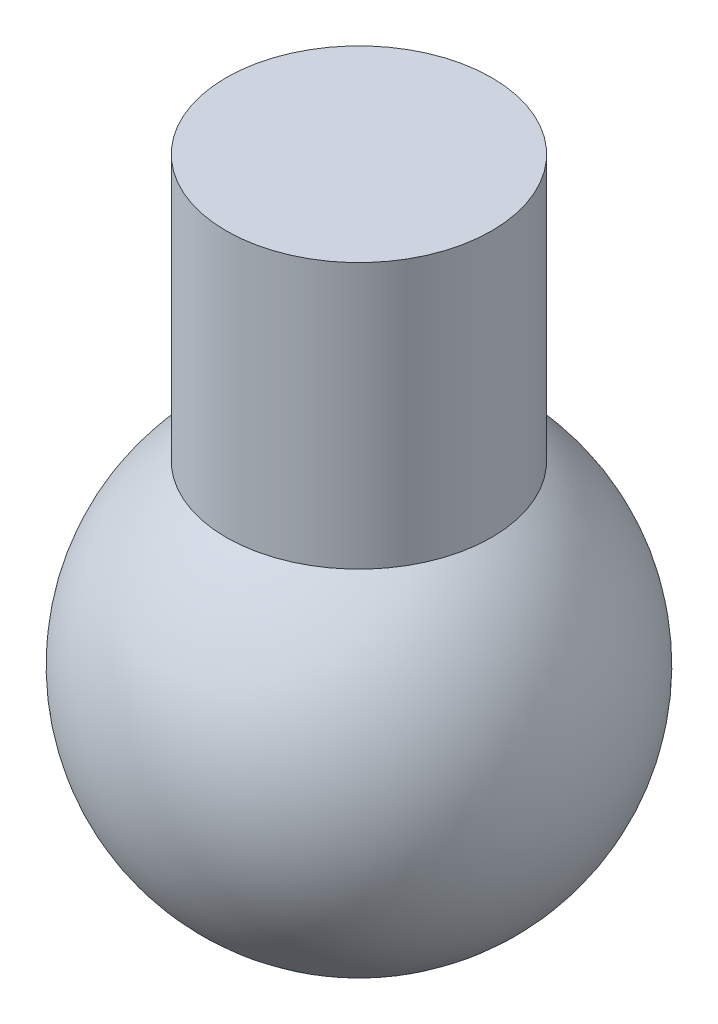
ISO-10303-21;
HEADER;
FILE_DESCRIPTION(('STEP AP214'),'2;1');
FILE_NAME('part.step','',(''),(''),'','','');
FILE_SCHEMA(('AUTOMOTIVE_DESIGN { 1 0 10303 214 1 1 1 1 }'));
ENDSEC;
DATA;
#1=APPLICATION_CONTEXT('core data for automotive mechanical design processes');
#2=APPLICATION_PROTOCOL_DEFINITION('international standard','automotive_design',2000,#1);
#3=PRODUCT_CONTEXT('',#1,'mechanical');
#4=PRODUCT('Part','Part','',(#3));
#5=PRODUCT_RELATED_PRODUCT_CATEGORY('part','',(#4));
#6=PRODUCT_DEFINITION_FORMATION('','',#4);
#7=PRODUCT_DEFINITION_CONTEXT('part definition',#1,'design');
#8=PRODUCT_DEFINITION('design','',#6,#7);
#9=PRODUCT_DEFINITION_SHAPE('','',#8);
#10=(LENGTH_UNIT() NAMED_UNIT(*) SI_UNIT(.MILLI.,.METRE.));
#11=(NAMED_UNIT(*) PLANE_ANGLE_UNIT() SI_UNIT($,.RADIAN.));
#12=(NAMED_UNIT(*) SI_UNIT($,.STERADIAN.) SOLID_ANGLE_UNIT());
#13=UNCERTAINTY_MEASURE_WITH_UNIT(LENGTH_MEASURE(1.E-05),#10,'distance_accuracy_value','');
#14=(GEOMETRIC_REPRESENTATION_CONTEXT(3) GLOBAL_UNCERTAINTY_ASSIGNED_CONTEXT((#13)) GLOBAL_UNIT_ASSIGNED_CONTEXT((#10,
#11,#12)) REPRESENTATION_CONTEXT('',''));
#15=CARTESIAN_POINT('',(0.,0.,0.));
#16=DIRECTION('',(0.,0.,1.));
#17=DIRECTION('',(1.,0.,0.));
#18=AXIS2_PLACEMENT_3D('',#15,#16,#17);
#19=CARTESIAN_POINT('',(0.,0.,0.));
#20=DIRECTION('',(1.,0.,0.));
#21=DIRECTION('',(0.,-1.,0.));
#22=AXIS2_PLACEMENT_3D('',#19,#20,#21);
#23=SPHERICAL_SURFACE('',#22,25.);
#24=CARTESIAN_POINT('',(0.,0.,0.));
#25=DIRECTION('',(0.,-1.,0.));
#26=DIRECTION('',(0.,0.,-1.));
#27=AXIS2_PLACEMENT_3D('',#24,#25,#26);
#28=SPHERICAL_SURFACE('',#27,25.);
#29=CARTESIAN_POINT('',(0.,20.,0.));
#30=DIRECTION('',(0.,-1.,0.));
#31=DIRECTION('',(0.,0.,-1.));
#32=AXIS2_PLACEMENT_3D('',#29,#30,#31);
#33=CIRCLE('',#32,15.);
#34=CARTESIAN_POINT('',(0.,20.,-15.));
#35=VERTEX_POINT('',#34);
#36=EDGE_CURVE('E10',#35,#35,#33,.F.);
#37=ORIENTED_EDGE('',*,*,#36,.F.);
#38=EDGE_LOOP('',(#37));
#39=FACE_BOUND('',#38,.T.);
#40=ADVANCED_FACE('F30',(#39),#28,.T.);
#41=CARTESIAN_POINT('',(0.,-25.002,0.));
#42=DIRECTION('',(0.,1.,0.));
#43=DIRECTION('',(0.,0.,1.));
#44=AXIS2_PLACEMENT_3D('',#41,#42,#43);
#45=CYLINDRICAL_SURFACE('',#44,15.);
#46=ORIENTED_EDGE('',*,*,#36,.T.);
#47=EDGE_LOOP('',(#46));
#48=FACE_BOUND('',#47,.T.);
#49=CARTESIAN_POINT('',(0.,50.,0.));
#50=DIRECTION('',(0.,1.,0.));
#51=DIRECTION('',(0.,0.,1.));
#52=AXIS2_PLACEMENT_3D('',#49,#50,#51);
#53=CIRCLE('',#52,15.);
#54=CARTESIAN_POINT('',(0.,50.,15.));
#55=VERTEX_POINT('',#54);
#56=EDGE_CURVE('E36',#55,#55,#53,.T.);
#57=ORIENTED_EDGE('',*,*,#56,.F.);
#58=EDGE_LOOP('',(#57));
#59=FACE_BOUND('',#58,.T.);
#60=ADVANCED_FACE('F44',(#48,#59),#45,.T.);
#61=CARTESIAN_POINT('',(0.,50.,0.));
#62=DIRECTION('',(0.,1.,0.));
#63=DIRECTION('',(0.,0.,1.));
#64=AXIS2_PLACEMENT_3D('',#61,#62,#63);
#65=PLANE('',#64);
#66=ORIENTED_EDGE('',*,*,#56,.T.);
#67=EDGE_LOOP('',(#66));
#68=FACE_BOUND('',#67,.T.);
#69=ADVANCED_FACE('F42',(#68),#65,.T.);
#70=CLOSED_SHELL('',(#40,#60,#69));
#71=MANIFOLD_SOLID_BREP('B2',#70);
#72=ADVANCED_BREP_SHAPE_REPRESENTATION('',(#18,#71),#14);
#73=SHAPE_DEFINITION_REPRESENTATION(#9,#72);
ENDSEC;
END-ISO-10303-21;
